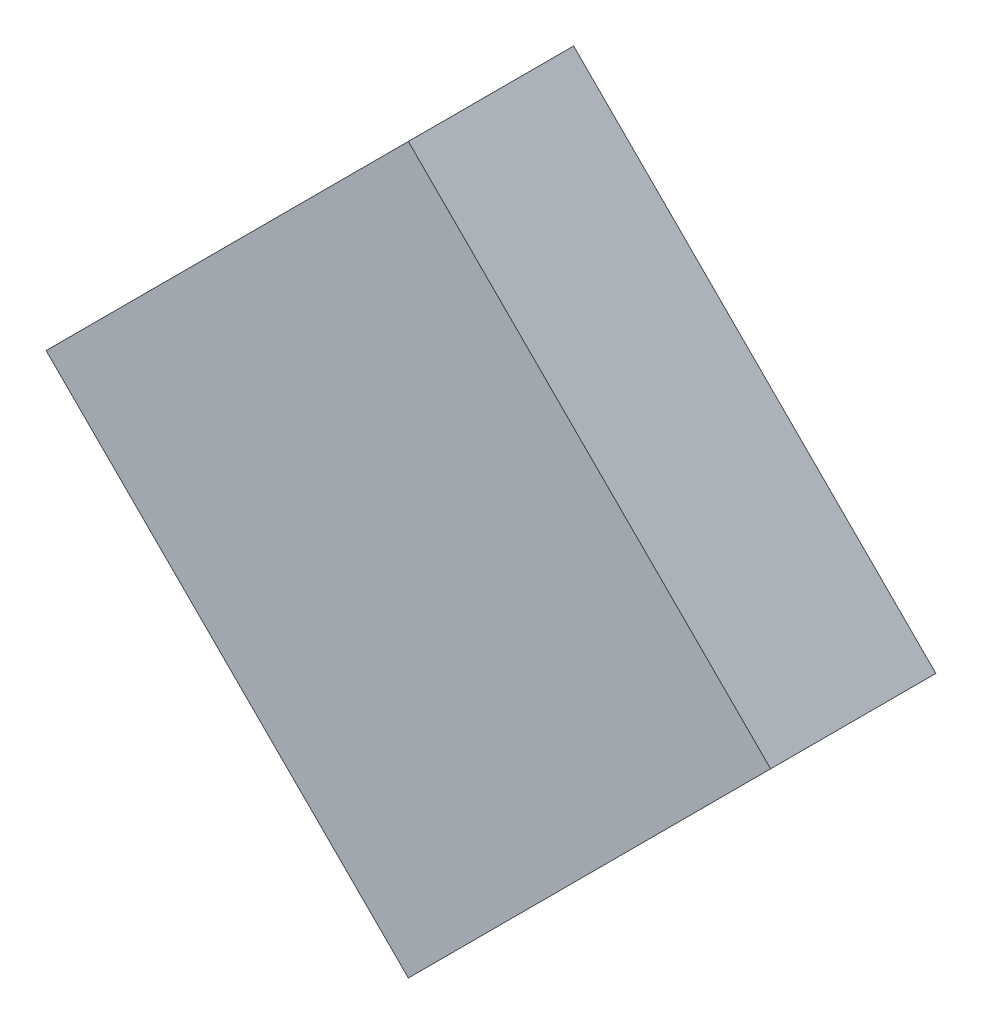
ISO-10303-21;
HEADER;
FILE_DESCRIPTION(('STEP AP214'),'2;1');
FILE_NAME('part.step','',(''),(''),'','','');
FILE_SCHEMA(('AUTOMOTIVE_DESIGN { 1 0 10303 214 1 1 1 1 }'));
ENDSEC;
DATA;
#1=APPLICATION_CONTEXT('core data for automotive mechanical design processes');
#2=APPLICATION_PROTOCOL_DEFINITION('international standard','automotive_design',2000,#1);
#3=PRODUCT_CONTEXT('',#1,'mechanical');
#4=PRODUCT('Part','Part','',(#3));
#5=PRODUCT_RELATED_PRODUCT_CATEGORY('part','',(#4));
#6=PRODUCT_DEFINITION_FORMATION('','',#4);
#7=PRODUCT_DEFINITION_CONTEXT('part definition',#1,'design');
#8=PRODUCT_DEFINITION('design','',#6,#7);
#9=PRODUCT_DEFINITION_SHAPE('','',#8);
#10=(LENGTH_UNIT() NAMED_UNIT(*) SI_UNIT(.MILLI.,.METRE.));
#11=(NAMED_UNIT(*) PLANE_ANGLE_UNIT() SI_UNIT($,.RADIAN.));
#12=(NAMED_UNIT(*) SI_UNIT($,.STERADIAN.) SOLID_ANGLE_UNIT());
#13=UNCERTAINTY_MEASURE_WITH_UNIT(LENGTH_MEASURE(1.E-05),#10,'distance_accuracy_value','');
#14=(GEOMETRIC_REPRESENTATION_CONTEXT(3) GLOBAL_UNCERTAINTY_ASSIGNED_CONTEXT((#13)) GLOBAL_UNIT_ASSIGNED_CONTEXT((#10,
#11,#12)) REPRESENTATION_CONTEXT('',''));
#15=CARTESIAN_POINT('',(0.,0.,0.));
#16=DIRECTION('',(0.,0.,1.));
#17=DIRECTION('',(1.,0.,0.));
#18=AXIS2_PLACEMENT_3D('',#15,#16,#17);
#19=CARTESIAN_POINT('',(-2.19203016,0.,1.00000054));
#20=DIRECTION('',(0.,0.,-1.));
#21=DIRECTION('',(-1.,0.,0.));
#22=AXIS2_PLACEMENT_3D('',#19,#20,#21);
#23=PLANE('',#22);
#24=DIRECTION('',(-0.707106781186548,-0.707106781186548,0.));
#25=VECTOR('',#24,1.);
#26=CARTESIAN_POINT('',(0.,-2.19203016,1.00000054));
#27=LINE('',#26,#25);
#28=CARTESIAN_POINT('',(0.,-2.19203016,1.00000054));
#29=VERTEX_POINT('',#28);
#30=CARTESIAN_POINT('',(2.19203016,0.,1.00000054));
#31=VERTEX_POINT('',#30);
#32=EDGE_CURVE('E54',#29,#31,#27,.F.);
#33=ORIENTED_EDGE('',*,*,#32,.T.);
#34=DIRECTION('',(0.707106781186548,-0.707106781186548,0.));
#35=VECTOR('',#34,1.);
#36=CARTESIAN_POINT('',(2.19203016,0.,1.00000054));
#37=LINE('',#36,#35);
#38=CARTESIAN_POINT('',(0.,2.19203016,1.00000054));
#39=VERTEX_POINT('',#38);
#40=EDGE_CURVE('E56',#31,#39,#37,.F.);
#41=ORIENTED_EDGE('',*,*,#40,.T.);
#42=DIRECTION('',(0.707106781186548,0.707106781186548,0.));
#43=VECTOR('',#42,1.);
#44=CARTESIAN_POINT('',(0.,2.19203016,1.00000054));
#45=LINE('',#44,#43);
#46=CARTESIAN_POINT('',(-2.19203016,0.,1.00000054));
#47=VERTEX_POINT('',#46);
#48=EDGE_CURVE('E19',#39,#47,#45,.F.);
#49=ORIENTED_EDGE('',*,*,#48,.T.);
#50=DIRECTION('',(-0.707106781186548,0.707106781186548,0.));
#51=VECTOR('',#50,1.);
#52=CARTESIAN_POINT('',(-2.19203016,0.,1.00000054));
#53=LINE('',#52,#51);
#54=EDGE_CURVE('E79',#47,#29,#53,.F.);
#55=ORIENTED_EDGE('',*,*,#54,.T.);
#56=EDGE_LOOP('',(#33,#41,#49,#55));
#57=FACE_BOUND('',#56,.T.);
#58=ADVANCED_FACE('F16',(#57),#23,.F.);
#59=CARTESIAN_POINT('',(0.,2.19203016,0.));
#60=DIRECTION('',(0.707106781186548,-0.707106781186548,0.));
#61=DIRECTION('',(0.707106781186548,0.707106781186548,0.));
#62=AXIS2_PLACEMENT_3D('',#59,#60,#61);
#63=PLANE('',#62);
#64=DIRECTION('',(0.,0.,1.));
#65=VECTOR('',#64,1.);
#66=CARTESIAN_POINT('',(-2.19203016,0.,0.));
#67=LINE('',#66,#65);
#68=CARTESIAN_POINT('',(-2.19203016,0.,0.));
#69=VERTEX_POINT('',#68);
#70=EDGE_CURVE('E67',#69,#47,#67,.T.);
#71=ORIENTED_EDGE('',*,*,#70,.T.);
#72=ORIENTED_EDGE('',*,*,#48,.F.);
#73=DIRECTION('',(0.,0.,1.));
#74=VECTOR('',#73,1.);
#75=CARTESIAN_POINT('',(0.,2.19203016,0.));
#76=LINE('',#75,#74);
#77=CARTESIAN_POINT('',(0.,2.19203016,0.));
#78=VERTEX_POINT('',#77);
#79=EDGE_CURVE('E62',#39,#78,#76,.F.);
#80=ORIENTED_EDGE('',*,*,#79,.T.);
#81=DIRECTION('',(0.707106781186548,0.707106781186548,0.));
#82=VECTOR('',#81,1.);
#83=CARTESIAN_POINT('',(-2.19203016,0.,0.));
#84=LINE('',#83,#82);
#85=EDGE_CURVE('E82',#69,#78,#84,.T.);
#86=ORIENTED_EDGE('',*,*,#85,.F.);
#87=EDGE_LOOP('',(#71,#72,#80,#86));
#88=FACE_BOUND('',#87,.T.);
#89=ADVANCED_FACE('F64',(#88),#63,.F.);
#90=CARTESIAN_POINT('',(2.19203016,0.,0.));
#91=DIRECTION('',(-0.707106781186548,-0.707106781186548,0.));
#92=DIRECTION('',(0.707106781186548,-0.707106781186548,0.));
#93=AXIS2_PLACEMENT_3D('',#90,#91,#92);
#94=PLANE('',#93);
#95=ORIENTED_EDGE('',*,*,#79,.F.);
#96=ORIENTED_EDGE('',*,*,#40,.F.);
#97=DIRECTION('',(0.,0.,1.));
#98=VECTOR('',#97,1.);
#99=CARTESIAN_POINT('',(2.19203016,0.,0.));
#100=LINE('',#99,#98);
#101=CARTESIAN_POINT('',(2.19203016,0.,0.));
#102=VERTEX_POINT('',#101);
#103=EDGE_CURVE('E74',#31,#102,#100,.F.);
#104=ORIENTED_EDGE('',*,*,#103,.T.);
#105=DIRECTION('',(0.707106781186548,-0.707106781186548,0.));
#106=VECTOR('',#105,1.);
#107=CARTESIAN_POINT('',(0.,2.19203016,0.));
#108=LINE('',#107,#106);
#109=EDGE_CURVE('E71',#78,#102,#108,.T.);
#110=ORIENTED_EDGE('',*,*,#109,.F.);
#111=EDGE_LOOP('',(#95,#96,#104,#110));
#112=FACE_BOUND('',#111,.T.);
#113=ADVANCED_FACE('F69',(#112),#94,.F.);
#114=CARTESIAN_POINT('',(0.,-2.19203016,0.));
#115=DIRECTION('',(-0.707106781186548,0.707106781186548,0.));
#116=DIRECTION('',(-0.707106781186548,-0.707106781186548,0.));
#117=AXIS2_PLACEMENT_3D('',#114,#115,#116);
#118=PLANE('',#117);
#119=ORIENTED_EDGE('',*,*,#103,.F.);
#120=ORIENTED_EDGE('',*,*,#32,.F.);
#121=DIRECTION('',(0.,0.,1.));
#122=VECTOR('',#121,1.);
#123=CARTESIAN_POINT('',(0.,-2.19203016,0.));
#124=LINE('',#123,#122);
#125=CARTESIAN_POINT('',(0.,-2.19203016,0.));
#126=VERTEX_POINT('',#125);
#127=EDGE_CURVE('E34',#29,#126,#124,.F.);
#128=ORIENTED_EDGE('',*,*,#127,.T.);
#129=DIRECTION('',(-0.707106781186548,-0.707106781186548,0.));
#130=VECTOR('',#129,1.);
#131=CARTESIAN_POINT('',(2.19203016,0.,0.));
#132=LINE('',#131,#130);
#133=EDGE_CURVE('E25',#102,#126,#132,.T.);
#134=ORIENTED_EDGE('',*,*,#133,.F.);
#135=EDGE_LOOP('',(#119,#120,#128,#134));
#136=FACE_BOUND('',#135,.T.);
#137=ADVANCED_FACE('F88',(#136),#118,.F.);
#138=CARTESIAN_POINT('',(-2.19203016,0.,0.));
#139=DIRECTION('',(0.707106781186548,0.707106781186548,0.));
#140=DIRECTION('',(-0.707106781186548,0.707106781186548,0.));
#141=AXIS2_PLACEMENT_3D('',#138,#139,#140);
#142=PLANE('',#141);
#143=ORIENTED_EDGE('',*,*,#127,.F.);
#144=ORIENTED_EDGE('',*,*,#54,.F.);
#145=ORIENTED_EDGE('',*,*,#70,.F.);
#146=DIRECTION('',(-0.707106781186548,0.707106781186548,0.));
#147=VECTOR('',#146,1.);
#148=CARTESIAN_POINT('',(0.,-2.19203016,0.));
#149=LINE('',#148,#147);
#150=EDGE_CURVE('E10',#126,#69,#149,.T.);
#151=ORIENTED_EDGE('',*,*,#150,.F.);
#152=EDGE_LOOP('',(#143,#144,#145,#151));
#153=FACE_BOUND('',#152,.T.);
#154=ADVANCED_FACE('F90',(#153),#142,.F.);
#155=CARTESIAN_POINT('',(-2.19203016,0.,0.));
#156=DIRECTION('',(0.,0.,-1.));
#157=DIRECTION('',(-1.,0.,0.));
#158=AXIS2_PLACEMENT_3D('',#155,#156,#157);
#159=PLANE('',#158);
#160=ORIENTED_EDGE('',*,*,#133,.T.);
#161=ORIENTED_EDGE('',*,*,#150,.T.);
#162=ORIENTED_EDGE('',*,*,#85,.T.);
#163=ORIENTED_EDGE('',*,*,#109,.T.);
#164=EDGE_LOOP('',(#160,#161,#162,#163));
#165=FACE_BOUND('',#164,.T.);
#166=ADVANCED_FACE('F87',(#165),#159,.T.);
#167=CLOSED_SHELL('',(#58,#89,#113,#137,#154,#166));
#168=MANIFOLD_SOLID_BREP('B1',#167);
#169=ADVANCED_BREP_SHAPE_REPRESENTATION('',(#18,#168),#14);
#170=SHAPE_DEFINITION_REPRESENTATION(#9,#169);
ENDSEC;
END-ISO-10303-21;
